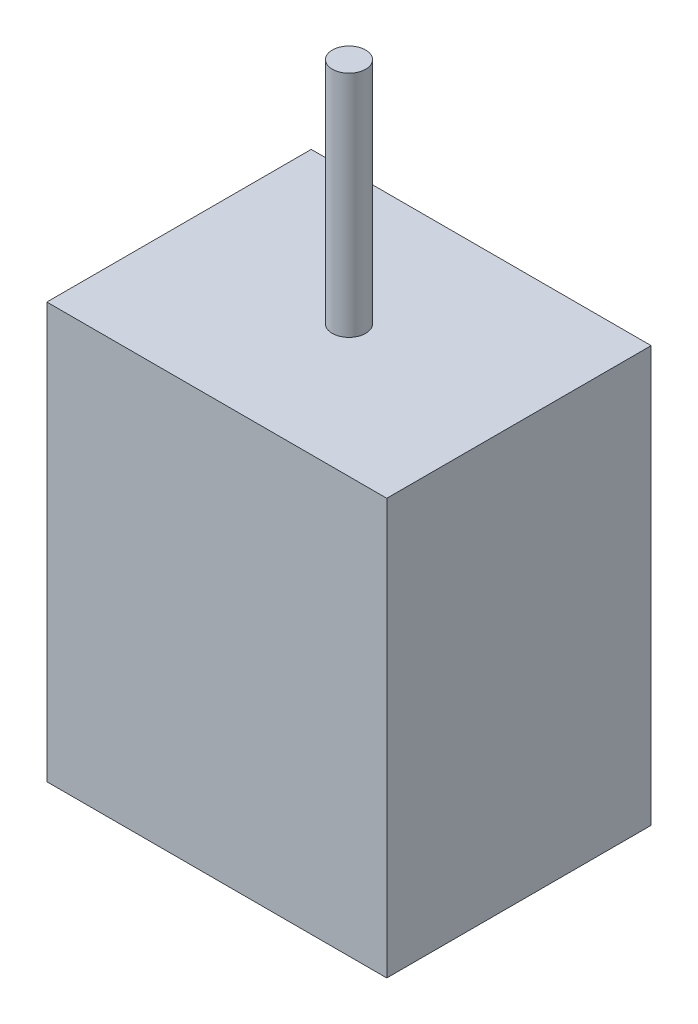
ISO-10303-21;
HEADER;
FILE_DESCRIPTION(('STEP AP214'),'2;1');
FILE_NAME('part.step','',(''),(''),'','','');
FILE_SCHEMA(('AUTOMOTIVE_DESIGN { 1 0 10303 214 1 1 1 1 }'));
ENDSEC;
DATA;
#1=APPLICATION_CONTEXT('core data for automotive mechanical design processes');
#2=APPLICATION_PROTOCOL_DEFINITION('international standard','automotive_design',2000,#1);
#3=PRODUCT_CONTEXT('',#1,'mechanical');
#4=PRODUCT('Part','Part','',(#3));
#5=PRODUCT_RELATED_PRODUCT_CATEGORY('part','',(#4));
#6=PRODUCT_DEFINITION_FORMATION('','',#4);
#7=PRODUCT_DEFINITION_CONTEXT('part definition',#1,'design');
#8=PRODUCT_DEFINITION('design','',#6,#7);
#9=PRODUCT_DEFINITION_SHAPE('','',#8);
#10=(LENGTH_UNIT() NAMED_UNIT(*) SI_UNIT(.MILLI.,.METRE.));
#11=(NAMED_UNIT(*) PLANE_ANGLE_UNIT() SI_UNIT($,.RADIAN.));
#12=(NAMED_UNIT(*) SI_UNIT($,.STERADIAN.) SOLID_ANGLE_UNIT());
#13=UNCERTAINTY_MEASURE_WITH_UNIT(LENGTH_MEASURE(1.E-05),#10,'distance_accuracy_value','');
#14=(GEOMETRIC_REPRESENTATION_CONTEXT(3) GLOBAL_UNCERTAINTY_ASSIGNED_CONTEXT((#13)) GLOBAL_UNIT_ASSIGNED_CONTEXT((#10,
#11,#12)) REPRESENTATION_CONTEXT('',''));
#15=CARTESIAN_POINT('',(0.,0.,0.));
#16=DIRECTION('',(0.,0.,1.));
#17=DIRECTION('',(1.,0.,0.));
#18=AXIS2_PLACEMENT_3D('',#15,#16,#17);
#19=CARTESIAN_POINT('',(7.65,18.7,0.));
#20=DIRECTION('',(1.,0.,0.));
#21=DIRECTION('',(0.,0.,-1.));
#22=AXIS2_PLACEMENT_3D('',#19,#20,#21);
#23=PLANE('',#22);
#24=DIRECTION('',(0.,0.,1.));
#25=VECTOR('',#24,1.);
#26=CARTESIAN_POINT('',(7.65,0.,0.));
#27=LINE('',#26,#25);
#28=CARTESIAN_POINT('',(7.65,0.,-5.95));
#29=VERTEX_POINT('',#28);
#30=CARTESIAN_POINT('',(7.65,0.,5.95));
#31=VERTEX_POINT('',#30);
#32=EDGE_CURVE('E116',#29,#31,#27,.T.);
#33=ORIENTED_EDGE('',*,*,#32,.F.);
#34=DIRECTION('',(0.,-1.,0.));
#35=VECTOR('',#34,1.);
#36=CARTESIAN_POINT('',(7.65,18.7,-5.95));
#37=LINE('',#36,#35);
#38=CARTESIAN_POINT('',(7.65,18.7,-5.95));
#39=VERTEX_POINT('',#38);
#40=EDGE_CURVE('E11',#39,#29,#37,.T.);
#41=ORIENTED_EDGE('',*,*,#40,.F.);
#42=DIRECTION('',(0.,0.,1.));
#43=VECTOR('',#42,1.);
#44=CARTESIAN_POINT('',(7.65,18.7,0.));
#45=LINE('',#44,#43);
#46=CARTESIAN_POINT('',(7.65,18.7,5.95));
#47=VERTEX_POINT('',#46);
#48=EDGE_CURVE('E106',#39,#47,#45,.T.);
#49=ORIENTED_EDGE('',*,*,#48,.T.);
#50=DIRECTION('',(0.,-1.,0.));
#51=VECTOR('',#50,1.);
#52=CARTESIAN_POINT('',(7.65,18.7,5.95));
#53=LINE('',#52,#51);
#54=EDGE_CURVE('E83',#47,#31,#53,.T.);
#55=ORIENTED_EDGE('',*,*,#54,.T.);
#56=EDGE_LOOP('',(#33,#41,#49,#55));
#57=FACE_BOUND('',#56,.T.);
#58=ADVANCED_FACE('F43',(#57),#23,.T.);
#59=CARTESIAN_POINT('',(0.,18.7,-5.95));
#60=DIRECTION('',(0.,0.,-1.));
#61=DIRECTION('',(-1.,0.,0.));
#62=AXIS2_PLACEMENT_3D('',#59,#60,#61);
#63=PLANE('',#62);
#64=DIRECTION('',(1.,0.,0.));
#65=VECTOR('',#64,1.);
#66=CARTESIAN_POINT('',(0.,0.,-5.95));
#67=LINE('',#66,#65);
#68=CARTESIAN_POINT('',(-7.65,0.,-5.95));
#69=VERTEX_POINT('',#68);
#70=EDGE_CURVE('E95',#69,#29,#67,.T.);
#71=ORIENTED_EDGE('',*,*,#70,.F.);
#72=DIRECTION('',(0.,-1.,0.));
#73=VECTOR('',#72,1.);
#74=CARTESIAN_POINT('',(-7.65,18.7,-5.95));
#75=LINE('',#74,#73);
#76=CARTESIAN_POINT('',(-7.65,18.7,-5.95));
#77=VERTEX_POINT('',#76);
#78=EDGE_CURVE('E52',#77,#69,#75,.T.);
#79=ORIENTED_EDGE('',*,*,#78,.F.);
#80=DIRECTION('',(1.,0.,0.));
#81=VECTOR('',#80,1.);
#82=CARTESIAN_POINT('',(0.,18.7,-5.95));
#83=LINE('',#82,#81);
#84=EDGE_CURVE('E93',#77,#39,#83,.T.);
#85=ORIENTED_EDGE('',*,*,#84,.T.);
#86=ORIENTED_EDGE('',*,*,#40,.T.);
#87=EDGE_LOOP('',(#71,#79,#85,#86));
#88=FACE_BOUND('',#87,.T.);
#89=ADVANCED_FACE('F91',(#88),#63,.T.);
#90=CARTESIAN_POINT('',(-7.65,18.7,0.));
#91=DIRECTION('',(1.,0.,0.));
#92=DIRECTION('',(0.,0.,-1.));
#93=AXIS2_PLACEMENT_3D('',#90,#91,#92);
#94=PLANE('',#93);
#95=DIRECTION('',(0.,0.,1.));
#96=VECTOR('',#95,1.);
#97=CARTESIAN_POINT('',(-7.65,0.,0.));
#98=LINE('',#97,#96);
#99=CARTESIAN_POINT('',(-7.65,0.,5.95));
#100=VERTEX_POINT('',#99);
#101=EDGE_CURVE('E122',#69,#100,#98,.T.);
#102=ORIENTED_EDGE('',*,*,#101,.T.);
#103=DIRECTION('',(0.,-1.,0.));
#104=VECTOR('',#103,1.);
#105=CARTESIAN_POINT('',(-7.65,18.7,5.95));
#106=LINE('',#105,#104);
#107=CARTESIAN_POINT('',(-7.65,18.7,5.95));
#108=VERTEX_POINT('',#107);
#109=EDGE_CURVE('E99',#108,#100,#106,.T.);
#110=ORIENTED_EDGE('',*,*,#109,.F.);
#111=DIRECTION('',(0.,0.,1.));
#112=VECTOR('',#111,1.);
#113=CARTESIAN_POINT('',(-7.65,18.7,0.));
#114=LINE('',#113,#112);
#115=EDGE_CURVE('E101',#77,#108,#114,.T.);
#116=ORIENTED_EDGE('',*,*,#115,.F.);
#117=ORIENTED_EDGE('',*,*,#78,.T.);
#118=EDGE_LOOP('',(#102,#110,#116,#117));
#119=FACE_BOUND('',#118,.T.);
#120=ADVANCED_FACE('F102',(#119),#94,.F.);
#121=CARTESIAN_POINT('',(0.,18.7,5.95));
#122=DIRECTION('',(0.,0.,-1.));
#123=DIRECTION('',(-1.,0.,0.));
#124=AXIS2_PLACEMENT_3D('',#121,#122,#123);
#125=PLANE('',#124);
#126=DIRECTION('',(1.,0.,0.));
#127=VECTOR('',#126,1.);
#128=CARTESIAN_POINT('',(0.,0.,5.95));
#129=LINE('',#128,#127);
#130=EDGE_CURVE('E76',#100,#31,#129,.T.);
#131=ORIENTED_EDGE('',*,*,#130,.T.);
#132=ORIENTED_EDGE('',*,*,#54,.F.);
#133=DIRECTION('',(1.,0.,0.));
#134=VECTOR('',#133,1.);
#135=CARTESIAN_POINT('',(0.,18.7,5.95));
#136=LINE('',#135,#134);
#137=EDGE_CURVE('E60',#108,#47,#136,.T.);
#138=ORIENTED_EDGE('',*,*,#137,.F.);
#139=ORIENTED_EDGE('',*,*,#109,.T.);
#140=EDGE_LOOP('',(#131,#132,#138,#139));
#141=FACE_BOUND('',#140,.T.);
#142=ADVANCED_FACE('F131',(#141),#125,.F.);
#143=CARTESIAN_POINT('',(0.,18.7,0.));
#144=DIRECTION('',(0.,1.,0.));
#145=DIRECTION('',(0.,0.,1.));
#146=AXIS2_PLACEMENT_3D('',#143,#144,#145);
#147=PLANE('',#146);
#148=CARTESIAN_POINT('',(0.,18.7,0.));
#149=DIRECTION('',(0.,1.,0.));
#150=DIRECTION('',(0.,0.,1.));
#151=AXIS2_PLACEMENT_3D('',#148,#149,#150);
#152=CIRCLE('',#151,0.75);
#153=CARTESIAN_POINT('',(0.,18.7,-0.749999999999999));
#154=VERTEX_POINT('',#153);
#155=EDGE_CURVE('E110',#154,#154,#152,.T.);
#156=ORIENTED_EDGE('',*,*,#155,.F.);
#157=EDGE_LOOP('',(#156));
#158=FACE_BOUND('',#157,.T.);
#159=ORIENTED_EDGE('',*,*,#48,.F.);
#160=ORIENTED_EDGE('',*,*,#84,.F.);
#161=ORIENTED_EDGE('',*,*,#115,.T.);
#162=ORIENTED_EDGE('',*,*,#137,.T.);
#163=EDGE_LOOP('',(#159,#160,#161,#162));
#164=FACE_BOUND('',#163,.T.);
#165=ADVANCED_FACE('F105',(#158,#164),#147,.T.);
#166=CARTESIAN_POINT('',(0.,0.,0.));
#167=DIRECTION('',(0.,1.,0.));
#168=DIRECTION('',(0.,0.,1.));
#169=AXIS2_PLACEMENT_3D('',#166,#167,#168);
#170=PLANE('',#169);
#171=ORIENTED_EDGE('',*,*,#32,.T.);
#172=ORIENTED_EDGE('',*,*,#130,.F.);
#173=ORIENTED_EDGE('',*,*,#101,.F.);
#174=ORIENTED_EDGE('',*,*,#70,.T.);
#175=EDGE_LOOP('',(#171,#172,#173,#174));
#176=FACE_BOUND('',#175,.T.);
#177=ADVANCED_FACE('F132',(#176),#170,.F.);
#178=CARTESIAN_POINT('',(0.,29.,0.));
#179=DIRECTION('',(0.,-1.,0.));
#180=DIRECTION('',(0.,0.,-1.));
#181=AXIS2_PLACEMENT_3D('',#178,#179,#180);
#182=CYLINDRICAL_SURFACE('',#181,0.75);
#183=CARTESIAN_POINT('',(0.,29.,0.));
#184=DIRECTION('',(0.,1.,0.));
#185=DIRECTION('',(0.,0.,1.));
#186=AXIS2_PLACEMENT_3D('',#183,#184,#185);
#187=CIRCLE('',#186,0.75);
#188=CARTESIAN_POINT('',(0.,29.,-0.749999999999999));
#189=VERTEX_POINT('',#188);
#190=EDGE_CURVE('E119',#189,#189,#187,.T.);
#191=CARTESIAN_POINT('',(0.,18.7,-0.749999999999999));
#192=CARTESIAN_POINT('',(0.,18.8072916666667,-0.749999999999999));
#193=CARTESIAN_POINT('',(0.,18.9145833333333,-0.749999999999999));
#194=CARTESIAN_POINT('',(0.,19.1291666666667,-0.749999999999999));
#195=CARTESIAN_POINT('',(0.,19.2364583333333,-0.749999999999999));
#196=CARTESIAN_POINT('',(0.,19.4510416666667,-0.749999999999999));
#197=CARTESIAN_POINT('',(0.,19.5583333333333,-0.749999999999999));
#198=CARTESIAN_POINT('',(0.,19.7729166666667,-0.749999999999999));
#199=CARTESIAN_POINT('',(0.,19.8802083333333,-0.749999999999999));
#200=CARTESIAN_POINT('',(0.,20.0947916666667,-0.749999999999999));
#201=CARTESIAN_POINT('',(0.,20.2020833333333,-0.749999999999999));
#202=CARTESIAN_POINT('',(0.,20.4166666666667,-0.749999999999999));
#203=CARTESIAN_POINT('',(0.,20.5239583333333,-0.749999999999999));
#204=CARTESIAN_POINT('',(0.,20.7385416666667,-0.749999999999999));
#205=CARTESIAN_POINT('',(0.,20.8458333333333,-0.749999999999999));
#206=CARTESIAN_POINT('',(0.,21.0604166666667,-0.749999999999999));
#207=CARTESIAN_POINT('',(0.,21.1677083333333,-0.749999999999999));
#208=CARTESIAN_POINT('',(0.,21.3822916666667,-0.749999999999999));
#209=CARTESIAN_POINT('',(0.,21.4895833333333,-0.749999999999999));
#210=CARTESIAN_POINT('',(0.,21.7041666666667,-0.749999999999999));
#211=CARTESIAN_POINT('',(0.,21.8114583333333,-0.749999999999999));
#212=CARTESIAN_POINT('',(0.,22.0260416666667,-0.749999999999999));
#213=CARTESIAN_POINT('',(0.,22.1333333333333,-0.749999999999999));
#214=CARTESIAN_POINT('',(0.,22.3479166666667,-0.749999999999999));
#215=CARTESIAN_POINT('',(0.,22.4552083333333,-0.749999999999999));
#216=CARTESIAN_POINT('',(0.,22.6697916666667,-0.749999999999999));
#217=CARTESIAN_POINT('',(0.,22.7770833333333,-0.749999999999999));
#218=CARTESIAN_POINT('',(0.,22.9916666666667,-0.749999999999999));
#219=CARTESIAN_POINT('',(0.,23.0989583333333,-0.749999999999999));
#220=CARTESIAN_POINT('',(0.,23.3135416666667,-0.749999999999999));
#221=CARTESIAN_POINT('',(0.,23.4208333333333,-0.749999999999999));
#222=CARTESIAN_POINT('',(0.,23.6354166666667,-0.749999999999999));
#223=CARTESIAN_POINT('',(0.,23.7427083333333,-0.749999999999999));
#224=CARTESIAN_POINT('',(0.,23.9572916666667,-0.749999999999999));
#225=CARTESIAN_POINT('',(0.,24.0645833333333,-0.749999999999999));
#226=CARTESIAN_POINT('',(0.,24.2791666666667,-0.749999999999999));
#227=CARTESIAN_POINT('',(0.,24.3864583333333,-0.749999999999999));
#228=CARTESIAN_POINT('',(0.,24.6010416666667,-0.749999999999999));
#229=CARTESIAN_POINT('',(0.,24.7083333333333,-0.749999999999999));
#230=CARTESIAN_POINT('',(0.,24.9229166666667,-0.749999999999999));
#231=CARTESIAN_POINT('',(0.,25.0302083333333,-0.749999999999999));
#232=CARTESIAN_POINT('',(0.,25.2447916666667,-0.749999999999999));
#233=CARTESIAN_POINT('',(0.,25.3520833333333,-0.749999999999999));
#234=CARTESIAN_POINT('',(0.,25.5666666666667,-0.749999999999999));
#235=CARTESIAN_POINT('',(0.,25.6739583333333,-0.749999999999999));
#236=CARTESIAN_POINT('',(0.,25.8885416666667,-0.749999999999999));
#237=CARTESIAN_POINT('',(0.,25.9958333333333,-0.749999999999999));
#238=CARTESIAN_POINT('',(0.,26.2104166666667,-0.749999999999999));
#239=CARTESIAN_POINT('',(0.,26.3177083333333,-0.749999999999999));
#240=CARTESIAN_POINT('',(0.,26.5322916666667,-0.749999999999999));
#241=CARTESIAN_POINT('',(0.,26.6395833333333,-0.749999999999999));
#242=CARTESIAN_POINT('',(0.,26.8541666666667,-0.749999999999999));
#243=CARTESIAN_POINT('',(0.,26.9614583333333,-0.749999999999999));
#244=CARTESIAN_POINT('',(0.,27.1760416666667,-0.749999999999999));
#245=CARTESIAN_POINT('',(0.,27.2833333333333,-0.749999999999999));
#246=CARTESIAN_POINT('',(0.,27.4979166666667,-0.749999999999999));
#247=CARTESIAN_POINT('',(0.,27.6052083333333,-0.749999999999999));
#248=CARTESIAN_POINT('',(0.,27.8197916666667,-0.749999999999999));
#249=CARTESIAN_POINT('',(0.,27.9270833333333,-0.749999999999999));
#250=CARTESIAN_POINT('',(0.,28.1416666666667,-0.749999999999999));
#251=CARTESIAN_POINT('',(0.,28.2489583333333,-0.749999999999999));
#252=CARTESIAN_POINT('',(0.,28.4635416666667,-0.749999999999999));
#253=CARTESIAN_POINT('',(0.,28.5708333333333,-0.749999999999999));
#254=CARTESIAN_POINT('',(0.,28.7854166666667,-0.749999999999999));
#255=CARTESIAN_POINT('',(0.,28.8927083333333,-0.749999999999999));
#256=CARTESIAN_POINT('',(0.,29.,-0.749999999999999));
#257=B_SPLINE_CURVE_WITH_KNOTS('',3,(#191,#192,#193,#194,#195,#196,#197,#198,#199,#200,#201,
#202,#203,#204,#205,#206,#207,#208,#209,#210,#211,#212,#213,#214,#215,#216,#217,#218,#219,#220,
#221,#222,#223,#224,#225,#226,#227,#228,#229,#230,#231,#232,#233,#234,#235,#236,#237,#238,#239,
#240,#241,#242,#243,#244,#245,#246,#247,#248,#249,#250,#251,#252,#253,#254,#255,#256),
.UNSPECIFIED.,.F.,.F.,(4,2,2,2,2,2,2,2,2,2,2,2,2,2,2,2,2,2,2,2,2,2,2,2,2,2,2,2,2,2,2,2,4),(0.,
0.321875000000003,0.643750000000002,0.965625000000005,1.2875,1.609375,1.93125,2.253125,2.575,
2.896875,3.21875,3.540625,3.8625,4.184375,4.50625,4.828125,5.15,5.471875,5.79375,6.115625,
6.4375,6.759375,7.08125,7.403125,7.72500000000001,8.04687500000001,8.36875,8.690625,
9.01250000000001,9.334375,9.65625000000001,9.978125,10.3),.UNSPECIFIED.);
#258=EDGE_CURVE('BSEAM146',#154,#189,#257,.T.);
#259=ORIENTED_EDGE('',*,*,#155,.T.);
#260=ORIENTED_EDGE('',*,*,#190,.F.);
#261=ORIENTED_EDGE('',*,*,#258,.T.);
#262=ORIENTED_EDGE('',*,*,#258,.F.);
#263=EDGE_LOOP('',(#259,#261,#260,#262));
#264=FACE_BOUND('',#263,.T.);
#265=ADVANCED_FACE('F146',(#264),#182,.T.);
#266=CARTESIAN_POINT('',(0.,29.,0.));
#267=DIRECTION('',(0.,1.,0.));
#268=DIRECTION('',(0.,0.,1.));
#269=AXIS2_PLACEMENT_3D('',#266,#267,#268);
#270=PLANE('',#269);
#271=ORIENTED_EDGE('',*,*,#190,.T.);
#272=EDGE_LOOP('',(#271));
#273=FACE_BOUND('',#272,.T.);
#274=ADVANCED_FACE('F152',(#273),#270,.T.);
#275=CLOSED_SHELL('',(#58,#89,#120,#142,#165,#177,#265,#274));
#276=MANIFOLD_SOLID_BREP('B2',#275);
#277=ADVANCED_BREP_SHAPE_REPRESENTATION('',(#18,#276),#14);
#278=SHAPE_DEFINITION_REPRESENTATION(#9,#277);
ENDSEC;
END-ISO-10303-21;
